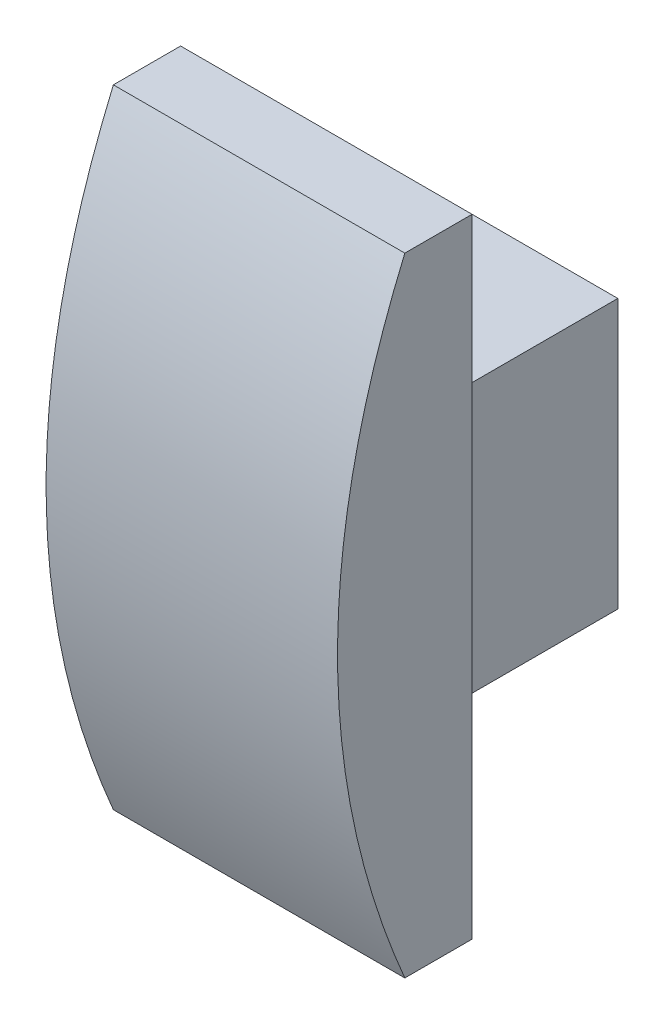
ISO-10303-21;
HEADER;
FILE_DESCRIPTION(('STEP AP214'),'2;1');
FILE_NAME('part.step','',(''),(''),'','','');
FILE_SCHEMA(('AUTOMOTIVE_DESIGN { 1 0 10303 214 1 1 1 1 }'));
ENDSEC;
DATA;
#1=APPLICATION_CONTEXT('core data for automotive mechanical design processes');
#2=APPLICATION_PROTOCOL_DEFINITION('international standard','automotive_design',2000,#1);
#3=PRODUCT_CONTEXT('',#1,'mechanical');
#4=PRODUCT('Part','Part','',(#3));
#5=PRODUCT_RELATED_PRODUCT_CATEGORY('part','',(#4));
#6=PRODUCT_DEFINITION_FORMATION('','',#4);
#7=PRODUCT_DEFINITION_CONTEXT('part definition',#1,'design');
#8=PRODUCT_DEFINITION('design','',#6,#7);
#9=PRODUCT_DEFINITION_SHAPE('','',#8);
#10=(LENGTH_UNIT() NAMED_UNIT(*) SI_UNIT(.MILLI.,.METRE.));
#11=(NAMED_UNIT(*) PLANE_ANGLE_UNIT() SI_UNIT($,.RADIAN.));
#12=(NAMED_UNIT(*) SI_UNIT($,.STERADIAN.) SOLID_ANGLE_UNIT());
#13=UNCERTAINTY_MEASURE_WITH_UNIT(LENGTH_MEASURE(1.E-05),#10,'distance_accuracy_value','');
#14=(GEOMETRIC_REPRESENTATION_CONTEXT(3) GLOBAL_UNCERTAINTY_ASSIGNED_CONTEXT((#13)) GLOBAL_UNIT_ASSIGNED_CONTEXT((#10,
#11,#12)) REPRESENTATION_CONTEXT('',''));
#15=CARTESIAN_POINT('',(0.,0.,0.));
#16=DIRECTION('',(0.,0.,1.));
#17=DIRECTION('',(1.,0.,0.));
#18=AXIS2_PLACEMENT_3D('',#15,#16,#17);
#19=CARTESIAN_POINT('',(0.,0.,0.));
#20=DIRECTION('',(0.,0.,1.));
#21=DIRECTION('',(1.,0.,0.));
#22=AXIS2_PLACEMENT_3D('',#19,#20,#21);
#23=PLANE('',#22);
#24=DIRECTION('',(0.,-1.,0.));
#25=VECTOR('',#24,1.);
#26=CARTESIAN_POINT('',(-1.45,1.95,0.));
#27=LINE('',#26,#25);
#28=CARTESIAN_POINT('',(-1.45,1.95,0.));
#29=VERTEX_POINT('',#28);
#30=CARTESIAN_POINT('',(-1.45,-4.05,0.));
#31=VERTEX_POINT('',#30);
#32=EDGE_CURVE('E237',#29,#31,#27,.T.);
#33=ORIENTED_EDGE('',*,*,#32,.F.);
#34=DIRECTION('',(-1.,0.,0.));
#35=VECTOR('',#34,1.);
#36=CARTESIAN_POINT('',(-1.45,1.95,0.));
#37=LINE('',#36,#35);
#38=CARTESIAN_POINT('',(3.55,1.95,0.));
#39=VERTEX_POINT('',#38);
#40=EDGE_CURVE('E243',#39,#29,#37,.T.);
#41=ORIENTED_EDGE('',*,*,#40,.F.);
#42=DIRECTION('',(0.,1.,0.));
#43=VECTOR('',#42,1.);
#44=CARTESIAN_POINT('',(3.55,1.95,0.));
#45=LINE('',#44,#43);
#46=CARTESIAN_POINT('',(3.55,-4.05,0.));
#47=VERTEX_POINT('',#46);
#48=EDGE_CURVE('E262',#47,#39,#45,.T.);
#49=ORIENTED_EDGE('',*,*,#48,.F.);
#50=DIRECTION('',(1.,0.,0.));
#51=VECTOR('',#50,1.);
#52=CARTESIAN_POINT('',(-1.45,-4.05,0.));
#53=LINE('',#52,#51);
#54=EDGE_CURVE('E259',#31,#47,#53,.T.);
#55=ORIENTED_EDGE('',*,*,#54,.F.);
#56=EDGE_LOOP('',(#33,#41,#49,#55));
#57=FACE_BOUND('',#56,.T.);
#58=DIRECTION('',(0.,-1.,0.));
#59=VECTOR('',#58,1.);
#60=CARTESIAN_POINT('',(0.,0.,0.));
#61=LINE('',#60,#59);
#62=CARTESIAN_POINT('',(0.,0.,0.));
#63=VERTEX_POINT('',#62);
#64=CARTESIAN_POINT('',(0.,-2.1,0.));
#65=VERTEX_POINT('',#64);
#66=EDGE_CURVE('E91',#63,#65,#61,.T.);
#67=ORIENTED_EDGE('',*,*,#66,.T.);
#68=DIRECTION('',(1.,0.,0.));
#69=VECTOR('',#68,1.);
#70=CARTESIAN_POINT('',(0.,-2.1,0.));
#71=LINE('',#70,#69);
#72=CARTESIAN_POINT('',(2.1,-2.1,0.));
#73=VERTEX_POINT('',#72);
#74=EDGE_CURVE('E215',#65,#73,#71,.T.);
#75=ORIENTED_EDGE('',*,*,#74,.T.);
#76=DIRECTION('',(0.,1.,0.));
#77=VECTOR('',#76,1.);
#78=CARTESIAN_POINT('',(2.1,0.,0.));
#79=LINE('',#78,#77);
#80=CARTESIAN_POINT('',(2.1,0.,0.));
#81=VERTEX_POINT('',#80);
#82=EDGE_CURVE('E219',#73,#81,#79,.T.);
#83=ORIENTED_EDGE('',*,*,#82,.T.);
#84=DIRECTION('',(-1.,0.,0.));
#85=VECTOR('',#84,1.);
#86=CARTESIAN_POINT('',(0.,0.,0.));
#87=LINE('',#86,#85);
#88=EDGE_CURVE('E202',#81,#63,#87,.T.);
#89=ORIENTED_EDGE('',*,*,#88,.T.);
#90=EDGE_LOOP('',(#67,#75,#83,#89));
#91=FACE_BOUND('',#90,.T.);
#92=ADVANCED_FACE('F67',(#57,#91),#23,.F.);
#93=CARTESIAN_POINT('',(-1.45,1.95,4.));
#94=DIRECTION('',(1.,0.,0.));
#95=DIRECTION('',(0.,0.,-1.));
#96=AXIS2_PLACEMENT_3D('',#93,#94,#95);
#97=PLANE('',#96);
#98=ORIENTED_EDGE('',*,*,#32,.T.);
#99=DIRECTION('',(0.,0.,-1.));
#100=VECTOR('',#99,1.);
#101=CARTESIAN_POINT('',(-1.45,-4.05,4.));
#102=LINE('',#101,#100);
#103=CARTESIAN_POINT('',(-1.45,-4.05,4.));
#104=VERTEX_POINT('',#103);
#105=EDGE_CURVE('E12',#104,#31,#102,.T.);
#106=ORIENTED_EDGE('',*,*,#105,.F.);
#107=DIRECTION('',(0.,-1.,0.));
#108=VECTOR('',#107,1.);
#109=CARTESIAN_POINT('',(-1.45,1.95,4.));
#110=LINE('',#109,#108);
#111=CARTESIAN_POINT('',(-1.45,1.95,4.));
#112=VERTEX_POINT('',#111);
#113=EDGE_CURVE('E238',#112,#104,#110,.T.);
#114=ORIENTED_EDGE('',*,*,#113,.F.);
#115=DIRECTION('',(0.,0.,-1.));
#116=VECTOR('',#115,1.);
#117=CARTESIAN_POINT('',(-1.45,1.95,4.));
#118=LINE('',#117,#116);
#119=EDGE_CURVE('E255',#112,#29,#118,.T.);
#120=ORIENTED_EDGE('',*,*,#119,.T.);
#121=EDGE_LOOP('',(#98,#106,#114,#120));
#122=FACE_BOUND('',#121,.T.);
#123=ADVANCED_FACE('F69',(#122),#97,.F.);
#124=CARTESIAN_POINT('',(-1.45,-4.05,4.));
#125=DIRECTION('',(0.,1.,0.));
#126=DIRECTION('',(-1.,0.,0.));
#127=AXIS2_PLACEMENT_3D('',#124,#125,#126);
#128=PLANE('',#127);
#129=ORIENTED_EDGE('',*,*,#54,.T.);
#130=DIRECTION('',(0.,0.,-1.));
#131=VECTOR('',#130,1.);
#132=CARTESIAN_POINT('',(3.55,-4.05,4.));
#133=LINE('',#132,#131);
#134=CARTESIAN_POINT('',(3.55,-4.05,4.));
#135=VERTEX_POINT('',#134);
#136=EDGE_CURVE('E76',#135,#47,#133,.T.);
#137=ORIENTED_EDGE('',*,*,#136,.F.);
#138=DIRECTION('',(1.,0.,0.));
#139=VECTOR('',#138,1.);
#140=CARTESIAN_POINT('',(-1.45,-4.05,4.));
#141=LINE('',#140,#139);
#142=EDGE_CURVE('E242',#104,#135,#141,.T.);
#143=ORIENTED_EDGE('',*,*,#142,.F.);
#144=ORIENTED_EDGE('',*,*,#105,.T.);
#145=EDGE_LOOP('',(#129,#137,#143,#144));
#146=FACE_BOUND('',#145,.T.);
#147=ADVANCED_FACE('F292',(#146),#128,.F.);
#148=CARTESIAN_POINT('',(3.55,1.95,4.));
#149=DIRECTION('',(-1.,0.,0.));
#150=DIRECTION('',(0.,0.,1.));
#151=AXIS2_PLACEMENT_3D('',#148,#149,#150);
#152=PLANE('',#151);
#153=ORIENTED_EDGE('',*,*,#48,.T.);
#154=DIRECTION('',(0.,0.,-1.));
#155=VECTOR('',#154,1.);
#156=CARTESIAN_POINT('',(3.55,1.95,4.));
#157=LINE('',#156,#155);
#158=CARTESIAN_POINT('',(3.55,1.95,4.));
#159=VERTEX_POINT('',#158);
#160=EDGE_CURVE('E270',#159,#39,#157,.T.);
#161=ORIENTED_EDGE('',*,*,#160,.F.);
#162=DIRECTION('',(0.,1.,0.));
#163=VECTOR('',#162,1.);
#164=CARTESIAN_POINT('',(3.55,1.95,4.));
#165=LINE('',#164,#163);
#166=EDGE_CURVE('E247',#135,#159,#165,.T.);
#167=ORIENTED_EDGE('',*,*,#166,.F.);
#168=ORIENTED_EDGE('',*,*,#136,.T.);
#169=EDGE_LOOP('',(#153,#161,#167,#168));
#170=FACE_BOUND('',#169,.T.);
#171=ADVANCED_FACE('F278',(#170),#152,.F.);
#172=CARTESIAN_POINT('',(-1.45,1.95,4.));
#173=DIRECTION('',(0.,-1.,0.));
#174=DIRECTION('',(1.,0.,0.));
#175=AXIS2_PLACEMENT_3D('',#172,#173,#174);
#176=PLANE('',#175);
#177=ORIENTED_EDGE('',*,*,#40,.T.);
#178=ORIENTED_EDGE('',*,*,#119,.F.);
#179=DIRECTION('',(-1.,0.,0.));
#180=VECTOR('',#179,1.);
#181=CARTESIAN_POINT('',(-1.45,1.95,4.));
#182=LINE('',#181,#180);
#183=EDGE_CURVE('E251',#159,#112,#182,.T.);
#184=ORIENTED_EDGE('',*,*,#183,.F.);
#185=ORIENTED_EDGE('',*,*,#160,.T.);
#186=EDGE_LOOP('',(#177,#178,#184,#185));
#187=FACE_BOUND('',#186,.T.);
#188=ADVANCED_FACE('F286',(#187),#176,.F.);
#189=CARTESIAN_POINT('',(0.,0.,4.));
#190=DIRECTION('',(1.,0.,0.));
#191=DIRECTION('',(0.,1.,0.));
#192=AXIS2_PLACEMENT_3D('',#189,#190,#191);
#193=PLANE('',#192);
#194=ORIENTED_EDGE('',*,*,#66,.F.);
#195=DIRECTION('',(0.,0.,-1.));
#196=VECTOR('',#195,1.);
#197=CARTESIAN_POINT('',(0.,0.,4.));
#198=LINE('',#197,#196);
#199=CARTESIAN_POINT('',(0.,0.,4.));
#200=VERTEX_POINT('',#199);
#201=EDGE_CURVE('E212',#200,#63,#198,.T.);
#202=ORIENTED_EDGE('',*,*,#201,.F.);
#203=DIRECTION('',(0.,-1.,0.));
#204=VECTOR('',#203,1.);
#205=CARTESIAN_POINT('',(0.,0.,4.));
#206=LINE('',#205,#204);
#207=CARTESIAN_POINT('',(0.,-2.1,4.));
#208=VERTEX_POINT('',#207);
#209=EDGE_CURVE('E197',#200,#208,#206,.T.);
#210=ORIENTED_EDGE('',*,*,#209,.T.);
#211=DIRECTION('',(0.,0.,-1.));
#212=VECTOR('',#211,1.);
#213=CARTESIAN_POINT('',(0.,-2.1,4.));
#214=LINE('',#213,#212);
#215=EDGE_CURVE('E234',#208,#65,#214,.T.);
#216=ORIENTED_EDGE('',*,*,#215,.T.);
#217=EDGE_LOOP('',(#194,#202,#210,#216));
#218=FACE_BOUND('',#217,.T.);
#219=ADVANCED_FACE('F305',(#218),#193,.T.);
#220=CARTESIAN_POINT('',(0.,-2.1,4.));
#221=DIRECTION('',(0.,1.,0.));
#222=DIRECTION('',(-1.,0.,0.));
#223=AXIS2_PLACEMENT_3D('',#220,#221,#222);
#224=PLANE('',#223);
#225=ORIENTED_EDGE('',*,*,#74,.F.);
#226=ORIENTED_EDGE('',*,*,#215,.F.);
#227=DIRECTION('',(1.,0.,0.));
#228=VECTOR('',#227,1.);
#229=CARTESIAN_POINT('',(0.,-2.1,4.));
#230=LINE('',#229,#228);
#231=CARTESIAN_POINT('',(2.1,-2.1,4.));
#232=VERTEX_POINT('',#231);
#233=EDGE_CURVE('E201',#208,#232,#230,.T.);
#234=ORIENTED_EDGE('',*,*,#233,.T.);
#235=DIRECTION('',(0.,0.,-1.));
#236=VECTOR('',#235,1.);
#237=CARTESIAN_POINT('',(2.1,-2.1,4.));
#238=LINE('',#237,#236);
#239=EDGE_CURVE('E231',#232,#73,#238,.T.);
#240=ORIENTED_EDGE('',*,*,#239,.T.);
#241=EDGE_LOOP('',(#225,#226,#234,#240));
#242=FACE_BOUND('',#241,.T.);
#243=ADVANCED_FACE('F311',(#242),#224,.T.);
#244=CARTESIAN_POINT('',(2.1,0.,4.));
#245=DIRECTION('',(-1.,0.,0.));
#246=DIRECTION('',(0.,0.,1.));
#247=AXIS2_PLACEMENT_3D('',#244,#245,#246);
#248=PLANE('',#247);
#249=ORIENTED_EDGE('',*,*,#82,.F.);
#250=ORIENTED_EDGE('',*,*,#239,.F.);
#251=DIRECTION('',(0.,1.,0.));
#252=VECTOR('',#251,1.);
#253=CARTESIAN_POINT('',(2.1,0.,4.));
#254=LINE('',#253,#252);
#255=CARTESIAN_POINT('',(2.1,0.,4.));
#256=VERTEX_POINT('',#255);
#257=EDGE_CURVE('E206',#232,#256,#254,.T.);
#258=ORIENTED_EDGE('',*,*,#257,.T.);
#259=DIRECTION('',(0.,0.,-1.));
#260=VECTOR('',#259,1.);
#261=CARTESIAN_POINT('',(2.1,0.,4.));
#262=LINE('',#261,#260);
#263=EDGE_CURVE('E228',#256,#81,#262,.T.);
#264=ORIENTED_EDGE('',*,*,#263,.T.);
#265=EDGE_LOOP('',(#249,#250,#258,#264));
#266=FACE_BOUND('',#265,.T.);
#267=ADVANCED_FACE('F315',(#266),#248,.T.);
#268=CARTESIAN_POINT('',(0.,0.,4.));
#269=DIRECTION('',(0.,-1.,0.));
#270=DIRECTION('',(1.,0.,0.));
#271=AXIS2_PLACEMENT_3D('',#268,#269,#270);
#272=PLANE('',#271);
#273=ORIENTED_EDGE('',*,*,#88,.F.);
#274=ORIENTED_EDGE('',*,*,#263,.F.);
#275=DIRECTION('',(-1.,0.,0.));
#276=VECTOR('',#275,1.);
#277=CARTESIAN_POINT('',(0.,0.,4.));
#278=LINE('',#277,#276);
#279=EDGE_CURVE('E83',#256,#200,#278,.T.);
#280=ORIENTED_EDGE('',*,*,#279,.T.);
#281=ORIENTED_EDGE('',*,*,#201,.T.);
#282=EDGE_LOOP('',(#273,#274,#280,#281));
#283=FACE_BOUND('',#282,.T.);
#284=ADVANCED_FACE('F320',(#283),#272,.T.);
#285=CARTESIAN_POINT('',(0.,0.,4.));
#286=DIRECTION('',(0.,0.,1.));
#287=DIRECTION('',(1.,0.,0.));
#288=AXIS2_PLACEMENT_3D('',#285,#286,#287);
#289=PLANE('',#288);
#290=ORIENTED_EDGE('',*,*,#233,.F.);
#291=ORIENTED_EDGE('',*,*,#209,.F.);
#292=ORIENTED_EDGE('',*,*,#279,.F.);
#293=ORIENTED_EDGE('',*,*,#257,.F.);
#294=EDGE_LOOP('',(#290,#291,#292,#293));
#295=FACE_BOUND('',#294,.T.);
#296=ADVANCED_FACE('F326',(#295),#289,.F.);
#297=DIRECTION('',(0.,-1.,0.));
#298=VECTOR('',#297,1.);
#299=CARTESIAN_POINT('',(-2.2,5.95,4.));
#300=LINE('',#299,#298);
#301=CARTESIAN_POINT('',(-2.2,5.95,4.));
#302=VERTEX_POINT('',#301);
#303=CARTESIAN_POINT('',(-2.2,-8.05,4.));
#304=VERTEX_POINT('',#303);
#305=EDGE_CURVE('E359',#302,#304,#300,.T.);
#306=ORIENTED_EDGE('',*,*,#305,.F.);
#307=DIRECTION('',(-1.,0.,0.));
#308=VECTOR('',#307,1.);
#309=CARTESIAN_POINT('',(-2.2,5.95,4.));
#310=LINE('',#309,#308);
#311=CARTESIAN_POINT('',(4.3,5.95,4.));
#312=VERTEX_POINT('',#311);
#313=EDGE_CURVE('E191',#312,#302,#310,.T.);
#314=ORIENTED_EDGE('',*,*,#313,.F.);
#315=DIRECTION('',(0.,1.,0.));
#316=VECTOR('',#315,1.);
#317=CARTESIAN_POINT('',(4.3,5.95,4.));
#318=LINE('',#317,#316);
#319=CARTESIAN_POINT('',(4.3,-8.05,4.));
#320=VERTEX_POINT('',#319);
#321=EDGE_CURVE('E182',#320,#312,#318,.T.);
#322=ORIENTED_EDGE('',*,*,#321,.F.);
#323=DIRECTION('',(1.,0.,0.));
#324=VECTOR('',#323,1.);
#325=CARTESIAN_POINT('',(-2.2,-8.05,4.));
#326=LINE('',#325,#324);
#327=EDGE_CURVE('E363',#304,#320,#326,.T.);
#328=ORIENTED_EDGE('',*,*,#327,.F.);
#329=EDGE_LOOP('',(#306,#314,#322,#328));
#330=FACE_BOUND('',#329,.T.);
#331=ORIENTED_EDGE('',*,*,#183,.T.);
#332=ORIENTED_EDGE('',*,*,#113,.T.);
#333=ORIENTED_EDGE('',*,*,#142,.T.);
#334=ORIENTED_EDGE('',*,*,#166,.T.);
#335=EDGE_LOOP('',(#331,#332,#333,#334));
#336=FACE_BOUND('',#335,.T.);
#337=ADVANCED_FACE('F291',(#330,#336),#289,.F.);
#338=CARTESIAN_POINT('',(-2.2,5.95,7.));
#339=DIRECTION('',(1.,0.,0.));
#340=DIRECTION('',(0.,0.,-1.));
#341=AXIS2_PLACEMENT_3D('',#338,#339,#340);
#342=PLANE('',#341);
#343=CARTESIAN_POINT('',(-2.2,5.94999999999999,5.5));
#344=CARTESIAN_POINT('',(-2.2,-1.05,8.5));
#345=CARTESIAN_POINT('',(-2.2,-8.05,5.5));
#346=B_SPLINE_CURVE_WITH_KNOTS('',2,(#343,#344,#345),.UNSPECIFIED.,.F.,.F.,(3,3),(0.,1.),.UNSPECIFIED.);
#347=CARTESIAN_POINT('',(-2.2,5.95,5.5));
#348=VERTEX_POINT('',#347);
#349=CARTESIAN_POINT('',(-2.2,-8.05,5.5));
#350=VERTEX_POINT('',#349);
#351=EDGE_CURVE('E170',#348,#350,#346,.T.);
#352=ORIENTED_EDGE('',*,*,#351,.F.);
#353=DIRECTION('',(0.,0.,-1.));
#354=VECTOR('',#353,1.);
#355=CARTESIAN_POINT('',(-2.2,5.95,7.));
#356=LINE('',#355,#354);
#357=EDGE_CURVE('E177',#348,#302,#356,.T.);
#358=ORIENTED_EDGE('',*,*,#357,.T.);
#359=ORIENTED_EDGE('',*,*,#305,.T.);
#360=DIRECTION('',(0.,0.,-1.));
#361=VECTOR('',#360,1.);
#362=CARTESIAN_POINT('',(-2.2,-8.05,7.));
#363=LINE('',#362,#361);
#364=EDGE_CURVE('E189',#350,#304,#363,.T.);
#365=ORIENTED_EDGE('',*,*,#364,.F.);
#366=EDGE_LOOP('',(#352,#358,#359,#365));
#367=FACE_BOUND('',#366,.T.);
#368=ADVANCED_FACE('F328',(#367),#342,.F.);
#369=CARTESIAN_POINT('',(-2.2,-8.05,7.));
#370=DIRECTION('',(0.,1.,0.));
#371=DIRECTION('',(0.,0.,1.));
#372=AXIS2_PLACEMENT_3D('',#369,#370,#371);
#373=PLANE('',#372);
#374=DIRECTION('',(0.,0.,-1.));
#375=VECTOR('',#374,1.);
#376=CARTESIAN_POINT('',(4.3,-8.05,7.));
#377=LINE('',#376,#375);
#378=CARTESIAN_POINT('',(4.3,-8.05,5.5));
#379=VERTEX_POINT('',#378);
#380=EDGE_CURVE('E185',#379,#320,#377,.T.);
#381=ORIENTED_EDGE('',*,*,#380,.F.);
#382=DIRECTION('',(-1.,0.,0.));
#383=VECTOR('',#382,1.);
#384=CARTESIAN_POINT('',(4.3,-8.05,5.5));
#385=LINE('',#384,#383);
#386=EDGE_CURVE('E165',#379,#350,#385,.T.);
#387=ORIENTED_EDGE('',*,*,#386,.T.);
#388=ORIENTED_EDGE('',*,*,#364,.T.);
#389=ORIENTED_EDGE('',*,*,#327,.T.);
#390=EDGE_LOOP('',(#381,#387,#388,#389));
#391=FACE_BOUND('',#390,.T.);
#392=ADVANCED_FACE('F331',(#391),#373,.F.);
#393=CARTESIAN_POINT('',(4.3,5.95,7.));
#394=DIRECTION('',(-1.,0.,0.));
#395=DIRECTION('',(0.,0.,1.));
#396=AXIS2_PLACEMENT_3D('',#393,#394,#395);
#397=PLANE('',#396);
#398=DIRECTION('',(0.,0.,-1.));
#399=VECTOR('',#398,1.);
#400=CARTESIAN_POINT('',(4.3,5.95,7.));
#401=LINE('',#400,#399);
#402=CARTESIAN_POINT('',(4.3,5.95,5.5));
#403=VERTEX_POINT('',#402);
#404=EDGE_CURVE('E175',#403,#312,#401,.T.);
#405=ORIENTED_EDGE('',*,*,#404,.F.);
#406=CARTESIAN_POINT('',(4.3,5.94999999999999,5.5));
#407=CARTESIAN_POINT('',(4.3,-1.05,8.5));
#408=CARTESIAN_POINT('',(4.3,-8.05,5.5));
#409=B_SPLINE_CURVE_WITH_KNOTS('',2,(#406,#407,#408),.UNSPECIFIED.,.F.,.F.,(3,3),(0.,1.),.UNSPECIFIED.);
#410=EDGE_CURVE('E159',#403,#379,#409,.T.);
#411=ORIENTED_EDGE('',*,*,#410,.T.);
#412=ORIENTED_EDGE('',*,*,#380,.T.);
#413=ORIENTED_EDGE('',*,*,#321,.T.);
#414=EDGE_LOOP('',(#405,#411,#412,#413));
#415=FACE_BOUND('',#414,.T.);
#416=ADVANCED_FACE('F180',(#415),#397,.F.);
#417=CARTESIAN_POINT('',(-2.2,5.95,7.));
#418=DIRECTION('',(0.,-1.,0.));
#419=DIRECTION('',(0.,0.,-1.));
#420=AXIS2_PLACEMENT_3D('',#417,#418,#419);
#421=PLANE('',#420);
#422=ORIENTED_EDGE('',*,*,#357,.F.);
#423=DIRECTION('',(-1.,0.,0.));
#424=VECTOR('',#423,1.);
#425=CARTESIAN_POINT('',(4.3,5.95,5.5));
#426=LINE('',#425,#424);
#427=EDGE_CURVE('E162',#403,#348,#426,.T.);
#428=ORIENTED_EDGE('',*,*,#427,.F.);
#429=ORIENTED_EDGE('',*,*,#404,.T.);
#430=ORIENTED_EDGE('',*,*,#313,.T.);
#431=EDGE_LOOP('',(#422,#428,#429,#430));
#432=FACE_BOUND('',#431,.T.);
#433=ADVANCED_FACE('F173',(#432),#421,.F.);
#434=DIRECTION('',(-1.,0.,0.));
#435=VECTOR('',#434,1.);
#436=SURFACE_OF_LINEAR_EXTRUSION('',#409,#435);
#437=ORIENTED_EDGE('',*,*,#351,.T.);
#438=ORIENTED_EDGE('',*,*,#386,.F.);
#439=ORIENTED_EDGE('',*,*,#410,.F.);
#440=ORIENTED_EDGE('',*,*,#427,.T.);
#441=EDGE_LOOP('',(#437,#438,#439,#440));
#442=FACE_BOUND('',#441,.T.);
#443=ADVANCED_FACE('F161',(#442),#436,.F.);
#444=CLOSED_SHELL('',(#92,#123,#147,#171,#188,#219,#243,#267,#284,#296,#337,#368,#392,#416,#433,#443));
#445=MANIFOLD_SOLID_BREP('B2',#444);
#446=ADVANCED_BREP_SHAPE_REPRESENTATION('',(#18,#445),#14);
#447=SHAPE_DEFINITION_REPRESENTATION(#9,#446);
ENDSEC;
END-ISO-10303-21;
